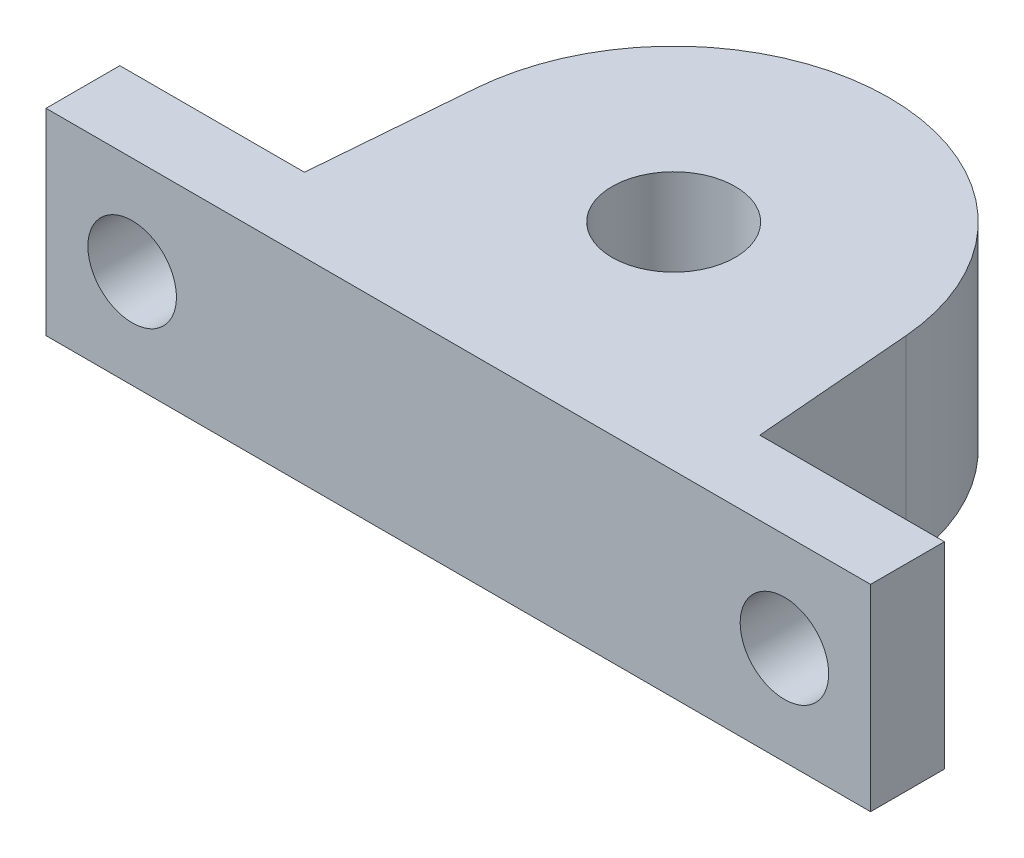
ISO-10303-21;
HEADER;
FILE_DESCRIPTION(('STEP AP214'),'2;1');
FILE_NAME('part.step','',(''),(''),'','','');
FILE_SCHEMA(('AUTOMOTIVE_DESIGN { 1 0 10303 214 1 1 1 1 }'));
ENDSEC;
DATA;
#1=APPLICATION_CONTEXT('core data for automotive mechanical design processes');
#2=APPLICATION_PROTOCOL_DEFINITION('international standard','automotive_design',2000,#1);
#3=PRODUCT_CONTEXT('',#1,'mechanical');
#4=PRODUCT('Part','Part','',(#3));
#5=PRODUCT_RELATED_PRODUCT_CATEGORY('part','',(#4));
#6=PRODUCT_DEFINITION_FORMATION('','',#4);
#7=PRODUCT_DEFINITION_CONTEXT('part definition',#1,'design');
#8=PRODUCT_DEFINITION('design','',#6,#7);
#9=PRODUCT_DEFINITION_SHAPE('','',#8);
#10=(LENGTH_UNIT() NAMED_UNIT(*) SI_UNIT(.MILLI.,.METRE.));
#11=(NAMED_UNIT(*) PLANE_ANGLE_UNIT() SI_UNIT($,.RADIAN.));
#12=(NAMED_UNIT(*) SI_UNIT($,.STERADIAN.) SOLID_ANGLE_UNIT());
#13=UNCERTAINTY_MEASURE_WITH_UNIT(LENGTH_MEASURE(1.E-05),#10,'distance_accuracy_value','');
#14=(GEOMETRIC_REPRESENTATION_CONTEXT(3) GLOBAL_UNCERTAINTY_ASSIGNED_CONTEXT((#13)) GLOBAL_UNIT_ASSIGNED_CONTEXT((#10,
#11,#12)) REPRESENTATION_CONTEXT('',''));
#15=CARTESIAN_POINT('',(0.,0.,0.));
#16=DIRECTION('',(0.,0.,1.));
#17=DIRECTION('',(1.,0.,0.));
#18=AXIS2_PLACEMENT_3D('',#15,#16,#17);
#19=CARTESIAN_POINT('',(0.,16.,0.));
#20=DIRECTION('',(0.,-1.,0.));
#21=DIRECTION('',(0.,0.,-1.));
#22=AXIS2_PLACEMENT_3D('',#19,#20,#21);
#23=CYLINDRICAL_SURFACE('',#22,17.5);
#24=CARTESIAN_POINT('',(0.,0.,0.));
#25=DIRECTION('',(0.,1.,0.));
#26=DIRECTION('',(0.,0.,1.));
#27=AXIS2_PLACEMENT_3D('',#24,#25,#26);
#28=CIRCLE('',#27,17.5);
#29=CARTESIAN_POINT('',(17.4416506984793,0.,-1.42787286277099));
#30=VERTEX_POINT('',#29);
#31=CARTESIAN_POINT('',(-17.4416506984793,0.,-1.42787286277099));
#32=VERTEX_POINT('',#31);
#33=EDGE_CURVE('E149',#30,#32,#28,.T.);
#34=ORIENTED_EDGE('',*,*,#33,.T.);
#35=DIRECTION('',(0.,-1.,0.));
#36=VECTOR('',#35,1.);
#37=CARTESIAN_POINT('',(-17.4416506984793,16.,-1.42787286277099));
#38=LINE('',#37,#36);
#39=CARTESIAN_POINT('',(-17.4416506984793,16.,-1.42787286277099));
#40=VERTEX_POINT('',#39);
#41=EDGE_CURVE('E11',#40,#32,#38,.T.);
#42=ORIENTED_EDGE('',*,*,#41,.F.);
#43=CARTESIAN_POINT('',(0.,16.,0.));
#44=DIRECTION('',(0.,1.,0.));
#45=DIRECTION('',(0.,0.,1.));
#46=AXIS2_PLACEMENT_3D('',#43,#44,#45);
#47=CIRCLE('',#46,17.5);
#48=CARTESIAN_POINT('',(17.4416506984793,16.,-1.42787286277099));
#49=VERTEX_POINT('',#48);
#50=EDGE_CURVE('E105',#49,#40,#47,.T.);
#51=ORIENTED_EDGE('',*,*,#50,.F.);
#52=DIRECTION('',(0.,-1.,0.));
#53=VECTOR('',#52,1.);
#54=CARTESIAN_POINT('',(17.4416506984793,16.,-1.42787286277099));
#55=LINE('',#54,#53);
#56=EDGE_CURVE('E145',#49,#30,#55,.T.);
#57=ORIENTED_EDGE('',*,*,#56,.T.);
#58=EDGE_LOOP('',(#34,#42,#51,#57));
#59=FACE_BOUND('',#58,.T.);
#60=ADVANCED_FACE('F47',(#59),#23,.T.);
#61=CARTESIAN_POINT('',(-17.4416506984793,16.,-1.42787286277098));
#62=DIRECTION('',(-0.996665754198815,0.,-0.0815927350154848));
#63=DIRECTION('',(-0.0815927350154848,0.,0.996665754198815));
#64=AXIS2_PLACEMENT_3D('',#61,#62,#63);
#65=PLANE('',#64);
#66=DIRECTION('',(0.0815927350154848,0.,-0.996665754198815));
#67=VECTOR('',#66,1.);
#68=CARTESIAN_POINT('',(-17.4416506984793,0.,-1.42787286277098));
#69=LINE('',#68,#67);
#70=CARTESIAN_POINT('',(-18.5,0.,11.5));
#71=VERTEX_POINT('',#70);
#72=EDGE_CURVE('E153',#71,#32,#69,.T.);
#73=ORIENTED_EDGE('',*,*,#72,.F.);
#74=DIRECTION('',(0.,-1.,0.));
#75=VECTOR('',#74,1.);
#76=CARTESIAN_POINT('',(-18.5,16.,11.5));
#77=LINE('',#76,#75);
#78=CARTESIAN_POINT('',(-18.5,16.,11.5));
#79=VERTEX_POINT('',#78);
#80=EDGE_CURVE('E57',#79,#71,#77,.T.);
#81=ORIENTED_EDGE('',*,*,#80,.F.);
#82=DIRECTION('',(0.0815927350154848,0.,-0.996665754198815));
#83=VECTOR('',#82,1.);
#84=CARTESIAN_POINT('',(-17.4416506984793,16.,-1.42787286277098));
#85=LINE('',#84,#83);
#86=EDGE_CURVE('E207',#79,#40,#85,.T.);
#87=ORIENTED_EDGE('',*,*,#86,.T.);
#88=ORIENTED_EDGE('',*,*,#41,.T.);
#89=EDGE_LOOP('',(#73,#81,#87,#88));
#90=FACE_BOUND('',#89,.T.);
#91=ADVANCED_FACE('F197',(#90),#65,.T.);
#92=CARTESIAN_POINT('',(0.,16.,11.5));
#93=DIRECTION('',(0.,0.,-1.));
#94=DIRECTION('',(-1.,0.,0.));
#95=AXIS2_PLACEMENT_3D('',#92,#93,#94);
#96=PLANE('',#95);
#97=CARTESIAN_POINT('',(-26.4999999999999,8.00000000000001,11.5));
#98=DIRECTION('',(0.,0.,-1.));
#99=DIRECTION('',(1.,0.,0.));
#100=AXIS2_PLACEMENT_3D('',#97,#98,#99);
#101=CIRCLE('',#100,3.59702453710189);
#102=CARTESIAN_POINT('',(-22.902975462898,8.00000000000001,11.5));
#103=VERTEX_POINT('',#102);
#104=EDGE_CURVE('E230',#103,#103,#101,.T.);
#105=ORIENTED_EDGE('',*,*,#104,.F.);
#106=EDGE_LOOP('',(#105));
#107=FACE_BOUND('',#106,.T.);
#108=DIRECTION('',(1.,0.,0.));
#109=VECTOR('',#108,1.);
#110=CARTESIAN_POINT('',(0.,0.,11.5));
#111=LINE('',#110,#109);
#112=CARTESIAN_POINT('',(-33.5,0.,11.5));
#113=VERTEX_POINT('',#112);
#114=EDGE_CURVE('E158',#113,#71,#111,.T.);
#115=ORIENTED_EDGE('',*,*,#114,.F.);
#116=DIRECTION('',(0.,-1.,0.));
#117=VECTOR('',#116,1.);
#118=CARTESIAN_POINT('',(-33.5,16.,11.5));
#119=LINE('',#118,#117);
#120=CARTESIAN_POINT('',(-33.5,16.,11.5));
#121=VERTEX_POINT('',#120);
#122=EDGE_CURVE('E184',#121,#113,#119,.T.);
#123=ORIENTED_EDGE('',*,*,#122,.F.);
#124=DIRECTION('',(1.,0.,0.));
#125=VECTOR('',#124,1.);
#126=CARTESIAN_POINT('',(0.,16.,11.5));
#127=LINE('',#126,#125);
#128=EDGE_CURVE('E194',#121,#79,#127,.T.);
#129=ORIENTED_EDGE('',*,*,#128,.T.);
#130=ORIENTED_EDGE('',*,*,#80,.T.);
#131=EDGE_LOOP('',(#115,#123,#129,#130));
#132=FACE_BOUND('',#131,.T.);
#133=ADVANCED_FACE('F192',(#107,#132),#96,.T.);
#134=CARTESIAN_POINT('',(-33.5,16.,0.));
#135=DIRECTION('',(-1.,0.,0.));
#136=DIRECTION('',(0.,0.,1.));
#137=AXIS2_PLACEMENT_3D('',#134,#135,#136);
#138=PLANE('',#137);
#139=DIRECTION('',(0.,0.,-1.));
#140=VECTOR('',#139,1.);
#141=CARTESIAN_POINT('',(-33.5,0.,0.));
#142=LINE('',#141,#140);
#143=CARTESIAN_POINT('',(-33.5,0.,17.5));
#144=VERTEX_POINT('',#143);
#145=EDGE_CURVE('E162',#144,#113,#142,.T.);
#146=ORIENTED_EDGE('',*,*,#145,.F.);
#147=DIRECTION('',(0.,-1.,0.));
#148=VECTOR('',#147,1.);
#149=CARTESIAN_POINT('',(-33.5,16.,17.5));
#150=LINE('',#149,#148);
#151=CARTESIAN_POINT('',(-33.5,16.,17.5));
#152=VERTEX_POINT('',#151);
#153=EDGE_CURVE('E181',#152,#144,#150,.T.);
#154=ORIENTED_EDGE('',*,*,#153,.F.);
#155=DIRECTION('',(0.,0.,-1.));
#156=VECTOR('',#155,1.);
#157=CARTESIAN_POINT('',(-33.5,16.,0.));
#158=LINE('',#157,#156);
#159=EDGE_CURVE('E206',#152,#121,#158,.T.);
#160=ORIENTED_EDGE('',*,*,#159,.T.);
#161=ORIENTED_EDGE('',*,*,#122,.T.);
#162=EDGE_LOOP('',(#146,#154,#160,#161));
#163=FACE_BOUND('',#162,.T.);
#164=ADVANCED_FACE('F204',(#163),#138,.T.);
#165=CARTESIAN_POINT('',(0.,16.,17.5));
#166=DIRECTION('',(0.,0.,-1.));
#167=DIRECTION('',(-1.,0.,0.));
#168=AXIS2_PLACEMENT_3D('',#165,#166,#167);
#169=PLANE('',#168);
#170=CARTESIAN_POINT('',(26.5,8.00000000000001,17.5));
#171=DIRECTION('',(0.,0.,-1.));
#172=DIRECTION('',(-1.,0.,0.));
#173=AXIS2_PLACEMENT_3D('',#170,#171,#172);
#174=CIRCLE('',#173,3.59702453710189);
#175=CARTESIAN_POINT('',(22.9029754628981,8.00000000000001,17.5));
#176=VERTEX_POINT('',#175);
#177=EDGE_CURVE('E225',#176,#176,#174,.T.);
#178=ORIENTED_EDGE('',*,*,#177,.T.);
#179=EDGE_LOOP('',(#178));
#180=FACE_BOUND('',#179,.T.);
#181=CARTESIAN_POINT('',(-26.4999999999999,8.00000000000001,17.5));
#182=DIRECTION('',(0.,0.,-1.));
#183=DIRECTION('',(-1.,0.,0.));
#184=AXIS2_PLACEMENT_3D('',#181,#182,#183);
#185=CIRCLE('',#184,3.59702453710189);
#186=CARTESIAN_POINT('',(-30.0970245371018,8.00000000000001,17.5));
#187=VERTEX_POINT('',#186);
#188=EDGE_CURVE('E50',#187,#187,#185,.T.);
#189=ORIENTED_EDGE('',*,*,#188,.T.);
#190=EDGE_LOOP('',(#189));
#191=FACE_BOUND('',#190,.T.);
#192=DIRECTION('',(1.,0.,0.));
#193=VECTOR('',#192,1.);
#194=CARTESIAN_POINT('',(0.,0.,17.5));
#195=LINE('',#194,#193);
#196=CARTESIAN_POINT('',(33.5,0.,17.5));
#197=VERTEX_POINT('',#196);
#198=EDGE_CURVE('E166',#144,#197,#195,.T.);
#199=ORIENTED_EDGE('',*,*,#198,.T.);
#200=DIRECTION('',(0.,-1.,0.));
#201=VECTOR('',#200,1.);
#202=CARTESIAN_POINT('',(33.5,16.,17.5));
#203=LINE('',#202,#201);
#204=CARTESIAN_POINT('',(33.5,16.,17.5));
#205=VERTEX_POINT('',#204);
#206=EDGE_CURVE('E138',#205,#197,#203,.T.);
#207=ORIENTED_EDGE('',*,*,#206,.F.);
#208=DIRECTION('',(1.,0.,0.));
#209=VECTOR('',#208,1.);
#210=CARTESIAN_POINT('',(0.,16.,17.5));
#211=LINE('',#210,#209);
#212=EDGE_CURVE('E127',#152,#205,#211,.T.);
#213=ORIENTED_EDGE('',*,*,#212,.F.);
#214=ORIENTED_EDGE('',*,*,#153,.T.);
#215=EDGE_LOOP('',(#199,#207,#213,#214));
#216=FACE_BOUND('',#215,.T.);
#217=ADVANCED_FACE('F251',(#180,#191,#216),#169,.F.);
#218=CARTESIAN_POINT('',(33.5,16.,0.));
#219=DIRECTION('',(-1.,0.,0.));
#220=DIRECTION('',(0.,0.,1.));
#221=AXIS2_PLACEMENT_3D('',#218,#219,#220);
#222=PLANE('',#221);
#223=DIRECTION('',(0.,0.,-1.));
#224=VECTOR('',#223,1.);
#225=CARTESIAN_POINT('',(33.5,0.,0.));
#226=LINE('',#225,#224);
#227=CARTESIAN_POINT('',(33.5,0.,11.5));
#228=VERTEX_POINT('',#227);
#229=EDGE_CURVE('E136',#197,#228,#226,.T.);
#230=ORIENTED_EDGE('',*,*,#229,.T.);
#231=DIRECTION('',(0.,-1.,0.));
#232=VECTOR('',#231,1.);
#233=CARTESIAN_POINT('',(33.5,16.,11.5));
#234=LINE('',#233,#232);
#235=CARTESIAN_POINT('',(33.5,16.,11.5));
#236=VERTEX_POINT('',#235);
#237=EDGE_CURVE('E133',#236,#228,#234,.T.);
#238=ORIENTED_EDGE('',*,*,#237,.F.);
#239=DIRECTION('',(0.,0.,-1.));
#240=VECTOR('',#239,1.);
#241=CARTESIAN_POINT('',(33.5,16.,0.));
#242=LINE('',#241,#240);
#243=EDGE_CURVE('E120',#205,#236,#242,.T.);
#244=ORIENTED_EDGE('',*,*,#243,.F.);
#245=ORIENTED_EDGE('',*,*,#206,.T.);
#246=EDGE_LOOP('',(#230,#238,#244,#245));
#247=FACE_BOUND('',#246,.T.);
#248=ADVANCED_FACE('F134',(#247),#222,.F.);
#249=CARTESIAN_POINT('',(0.,16.,11.5));
#250=DIRECTION('',(0.,0.,1.));
#251=DIRECTION('',(1.,0.,0.));
#252=AXIS2_PLACEMENT_3D('',#249,#250,#251);
#253=PLANE('',#252);
#254=CARTESIAN_POINT('',(26.5,8.00000000000001,11.5));
#255=DIRECTION('',(0.,0.,-1.));
#256=DIRECTION('',(-1.,0.,0.));
#257=AXIS2_PLACEMENT_3D('',#254,#255,#256);
#258=CIRCLE('',#257,3.59702453710189);
#259=CARTESIAN_POINT('',(22.9029754628981,8.00000000000001,11.5));
#260=VERTEX_POINT('',#259);
#261=EDGE_CURVE('E229',#260,#260,#258,.T.);
#262=ORIENTED_EDGE('',*,*,#261,.F.);
#263=EDGE_LOOP('',(#262));
#264=FACE_BOUND('',#263,.T.);
#265=DIRECTION('',(-1.,0.,0.));
#266=VECTOR('',#265,1.);
#267=CARTESIAN_POINT('',(0.,0.,11.5));
#268=LINE('',#267,#266);
#269=CARTESIAN_POINT('',(18.5,0.,11.5));
#270=VERTEX_POINT('',#269);
#271=EDGE_CURVE('E93',#228,#270,#268,.T.);
#272=ORIENTED_EDGE('',*,*,#271,.T.);
#273=DIRECTION('',(0.,-1.,0.));
#274=VECTOR('',#273,1.);
#275=CARTESIAN_POINT('',(18.5,16.,11.5));
#276=LINE('',#275,#274);
#277=CARTESIAN_POINT('',(18.5,16.,11.5));
#278=VERTEX_POINT('',#277);
#279=EDGE_CURVE('E139',#278,#270,#276,.T.);
#280=ORIENTED_EDGE('',*,*,#279,.F.);
#281=DIRECTION('',(-1.,0.,0.));
#282=VECTOR('',#281,1.);
#283=CARTESIAN_POINT('',(0.,16.,11.5));
#284=LINE('',#283,#282);
#285=EDGE_CURVE('E124',#236,#278,#284,.T.);
#286=ORIENTED_EDGE('',*,*,#285,.F.);
#287=ORIENTED_EDGE('',*,*,#237,.T.);
#288=EDGE_LOOP('',(#272,#280,#286,#287));
#289=FACE_BOUND('',#288,.T.);
#290=ADVANCED_FACE('F141',(#264,#289),#253,.F.);
#291=CARTESIAN_POINT('',(17.4416506984793,16.,-1.42787286277098));
#292=DIRECTION('',(-0.996665754198815,0.,0.0815927350154848));
#293=DIRECTION('',(0.0815927350154848,0.,0.996665754198815));
#294=AXIS2_PLACEMENT_3D('',#291,#292,#293);
#295=PLANE('',#294);
#296=DIRECTION('',(-0.0815927350154848,0.,-0.996665754198815));
#297=VECTOR('',#296,1.);
#298=CARTESIAN_POINT('',(17.4416506984793,0.,-1.42787286277098));
#299=LINE('',#298,#297);
#300=EDGE_CURVE('E99',#270,#30,#299,.T.);
#301=ORIENTED_EDGE('',*,*,#300,.T.);
#302=ORIENTED_EDGE('',*,*,#56,.F.);
#303=DIRECTION('',(-0.0815927350154848,0.,-0.996665754198815));
#304=VECTOR('',#303,1.);
#305=CARTESIAN_POINT('',(17.4416506984793,16.,-1.42787286277098));
#306=LINE('',#305,#304);
#307=EDGE_CURVE('E65',#278,#49,#306,.T.);
#308=ORIENTED_EDGE('',*,*,#307,.F.);
#309=ORIENTED_EDGE('',*,*,#279,.T.);
#310=EDGE_LOOP('',(#301,#302,#308,#309));
#311=FACE_BOUND('',#310,.T.);
#312=ADVANCED_FACE('F242',(#311),#295,.F.);
#313=CARTESIAN_POINT('',(0.,16.,0.));
#314=DIRECTION('',(0.,1.,0.));
#315=DIRECTION('',(0.,0.,1.));
#316=AXIS2_PLACEMENT_3D('',#313,#314,#315);
#317=PLANE('',#316);
#318=CARTESIAN_POINT('',(0.,16.,0.));
#319=DIRECTION('',(0.,1.,0.));
#320=DIRECTION('',(0.,0.,1.));
#321=AXIS2_PLACEMENT_3D('',#318,#319,#320);
#322=CIRCLE('',#321,5.);
#323=CARTESIAN_POINT('',(0.,16.,5.));
#324=VERTEX_POINT('',#323);
#325=EDGE_CURVE('E218',#324,#324,#322,.T.);
#326=ORIENTED_EDGE('',*,*,#325,.F.);
#327=EDGE_LOOP('',(#326));
#328=FACE_BOUND('',#327,.T.);
#329=ORIENTED_EDGE('',*,*,#50,.T.);
#330=ORIENTED_EDGE('',*,*,#86,.F.);
#331=ORIENTED_EDGE('',*,*,#128,.F.);
#332=ORIENTED_EDGE('',*,*,#159,.F.);
#333=ORIENTED_EDGE('',*,*,#212,.T.);
#334=ORIENTED_EDGE('',*,*,#243,.T.);
#335=ORIENTED_EDGE('',*,*,#285,.T.);
#336=ORIENTED_EDGE('',*,*,#307,.T.);
#337=EDGE_LOOP('',(#329,#330,#331,#332,#333,#334,#335,#336));
#338=FACE_BOUND('',#337,.T.);
#339=ADVANCED_FACE('F122',(#328,#338),#317,.T.);
#340=CARTESIAN_POINT('',(0.,0.,0.));
#341=DIRECTION('',(0.,1.,0.));
#342=DIRECTION('',(0.,0.,1.));
#343=AXIS2_PLACEMENT_3D('',#340,#341,#342);
#344=PLANE('',#343);
#345=CARTESIAN_POINT('',(0.,0.,0.));
#346=DIRECTION('',(0.,1.,0.));
#347=DIRECTION('',(0.,0.,1.));
#348=AXIS2_PLACEMENT_3D('',#345,#346,#347);
#349=CIRCLE('',#348,5.);
#350=CARTESIAN_POINT('',(0.,0.,5.));
#351=VERTEX_POINT('',#350);
#352=EDGE_CURVE('E154',#351,#351,#349,.T.);
#353=ORIENTED_EDGE('',*,*,#352,.T.);
#354=EDGE_LOOP('',(#353));
#355=FACE_BOUND('',#354,.T.);
#356=ORIENTED_EDGE('',*,*,#33,.F.);
#357=ORIENTED_EDGE('',*,*,#300,.F.);
#358=ORIENTED_EDGE('',*,*,#271,.F.);
#359=ORIENTED_EDGE('',*,*,#229,.F.);
#360=ORIENTED_EDGE('',*,*,#198,.F.);
#361=ORIENTED_EDGE('',*,*,#145,.T.);
#362=ORIENTED_EDGE('',*,*,#114,.T.);
#363=ORIENTED_EDGE('',*,*,#72,.T.);
#364=EDGE_LOOP('',(#356,#357,#358,#359,#360,#361,#362,#363));
#365=FACE_BOUND('',#364,.T.);
#366=ADVANCED_FACE('F200',(#355,#365),#344,.F.);
#367=CARTESIAN_POINT('',(0.,0.,0.));
#368=DIRECTION('',(0.,1.,0.));
#369=DIRECTION('',(0.,0.,1.));
#370=AXIS2_PLACEMENT_3D('',#367,#368,#369);
#371=CYLINDRICAL_SURFACE('',#370,5.);
#372=ORIENTED_EDGE('',*,*,#352,.F.);
#373=EDGE_LOOP('',(#372));
#374=FACE_BOUND('',#373,.T.);
#375=ORIENTED_EDGE('',*,*,#325,.T.);
#376=EDGE_LOOP('',(#375));
#377=FACE_BOUND('',#376,.T.);
#378=ADVANCED_FACE('F282',(#374,#377),#371,.F.);
#379=CARTESIAN_POINT('',(26.5,8.00000000000001,27.5));
#380=DIRECTION('',(0.,0.,-1.));
#381=DIRECTION('',(-1.,0.,0.));
#382=AXIS2_PLACEMENT_3D('',#379,#380,#381);
#383=CYLINDRICAL_SURFACE('',#382,3.59702453710189);
#384=ORIENTED_EDGE('',*,*,#261,.T.);
#385=EDGE_LOOP('',(#384));
#386=FACE_BOUND('',#385,.T.);
#387=ORIENTED_EDGE('',*,*,#177,.F.);
#388=EDGE_LOOP('',(#387));
#389=FACE_BOUND('',#388,.T.);
#390=ADVANCED_FACE('F238',(#386,#389),#383,.F.);
#391=CARTESIAN_POINT('',(-26.4999999999999,8.00000000000001,27.5));
#392=DIRECTION('',(0.,0.,-1.));
#393=DIRECTION('',(-1.,0.,0.));
#394=AXIS2_PLACEMENT_3D('',#391,#392,#393);
#395=CYLINDRICAL_SURFACE('',#394,3.59702453710189);
#396=ORIENTED_EDGE('',*,*,#104,.T.);
#397=EDGE_LOOP('',(#396));
#398=FACE_BOUND('',#397,.T.);
#399=ORIENTED_EDGE('',*,*,#188,.F.);
#400=EDGE_LOOP('',(#399));
#401=FACE_BOUND('',#400,.T.);
#402=ADVANCED_FACE('F276',(#398,#401),#395,.F.);
#403=CLOSED_SHELL('',(#60,#91,#133,#164,#217,#248,#290,#312,#339,#366,#378,#390,#402));
#404=MANIFOLD_SOLID_BREP('B2',#403);
#405=ADVANCED_BREP_SHAPE_REPRESENTATION('',(#18,#404),#14);
#406=SHAPE_DEFINITION_REPRESENTATION(#9,#405);
ENDSEC;
END-ISO-10303-21;
